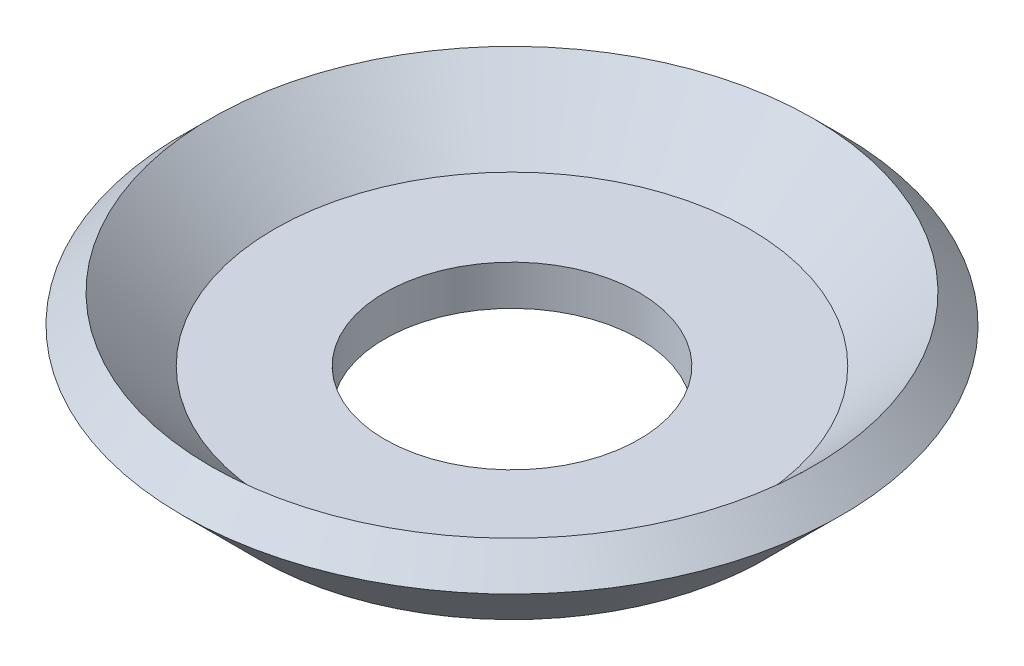
ISO-10303-21;
HEADER;
FILE_DESCRIPTION(('STEP AP214'),'2;1');
FILE_NAME('part.step','',(''),(''),'','','');
FILE_SCHEMA(('AUTOMOTIVE_DESIGN { 1 0 10303 214 1 1 1 1 }'));
ENDSEC;
DATA;
#1=APPLICATION_CONTEXT('core data for automotive mechanical design processes');
#2=APPLICATION_PROTOCOL_DEFINITION('international standard','automotive_design',2000,#1);
#3=PRODUCT_CONTEXT('',#1,'mechanical');
#4=PRODUCT('Part','Part','',(#3));
#5=PRODUCT_RELATED_PRODUCT_CATEGORY('part','',(#4));
#6=PRODUCT_DEFINITION_FORMATION('','',#4);
#7=PRODUCT_DEFINITION_CONTEXT('part definition',#1,'design');
#8=PRODUCT_DEFINITION('design','',#6,#7);
#9=PRODUCT_DEFINITION_SHAPE('','',#8);
#10=(LENGTH_UNIT() NAMED_UNIT(*) SI_UNIT(.MILLI.,.METRE.));
#11=(NAMED_UNIT(*) PLANE_ANGLE_UNIT() SI_UNIT($,.RADIAN.));
#12=(NAMED_UNIT(*) SI_UNIT($,.STERADIAN.) SOLID_ANGLE_UNIT());
#13=UNCERTAINTY_MEASURE_WITH_UNIT(LENGTH_MEASURE(1.E-05),#10,'distance_accuracy_value','');
#14=(GEOMETRIC_REPRESENTATION_CONTEXT(3) GLOBAL_UNCERTAINTY_ASSIGNED_CONTEXT((#13)) GLOBAL_UNIT_ASSIGNED_CONTEXT((#10,
#11,#12)) REPRESENTATION_CONTEXT('',''));
#15=CARTESIAN_POINT('',(0.,0.,0.));
#16=DIRECTION('',(0.,0.,1.));
#17=DIRECTION('',(1.,0.,0.));
#18=AXIS2_PLACEMENT_3D('',#15,#16,#17);
#19=CARTESIAN_POINT('',(0.,0.,0.));
#20=DIRECTION('',(0.,-1.,0.));
#21=DIRECTION('',(0.,0.,-1.));
#22=AXIS2_PLACEMENT_3D('',#19,#20,#21);
#23=CYLINDRICAL_SURFACE('',#22,4.7625);
#24=CARTESIAN_POINT('',(0.,1.5,0.));
#25=DIRECTION('',(0.,-1.,0.));
#26=DIRECTION('',(0.,0.,-1.));
#27=AXIS2_PLACEMENT_3D('',#24,#25,#26);
#28=CIRCLE('',#27,4.7625);
#29=CARTESIAN_POINT('',(0.,1.5,-4.7625));
#30=VERTEX_POINT('',#29);
#31=EDGE_CURVE('E64',#30,#30,#28,.T.);
#32=ORIENTED_EDGE('',*,*,#31,.F.);
#33=EDGE_LOOP('',(#32));
#34=FACE_BOUND('',#33,.T.);
#35=CARTESIAN_POINT('',(0.,0.,0.));
#36=DIRECTION('',(0.,-1.,0.));
#37=DIRECTION('',(0.,0.,-1.));
#38=AXIS2_PLACEMENT_3D('',#35,#36,#37);
#39=CIRCLE('',#38,4.7625);
#40=CARTESIAN_POINT('',(0.,0.,-4.7625));
#41=VERTEX_POINT('',#40);
#42=EDGE_CURVE('E10',#41,#41,#39,.T.);
#43=ORIENTED_EDGE('',*,*,#42,.T.);
#44=EDGE_LOOP('',(#43));
#45=FACE_BOUND('',#44,.T.);
#46=ADVANCED_FACE('F37',(#34,#45),#23,.F.);
#47=CARTESIAN_POINT('',(0.,0.,4.7625));
#48=DIRECTION('',(0.,1.,0.));
#49=DIRECTION('',(0.,0.,1.));
#50=AXIS2_PLACEMENT_3D('',#47,#48,#49);
#51=PLANE('',#50);
#52=ORIENTED_EDGE('',*,*,#42,.F.);
#53=EDGE_LOOP('',(#52));
#54=FACE_BOUND('',#53,.T.);
#55=CARTESIAN_POINT('',(0.,0.,0.));
#56=DIRECTION('',(0.,-1.,0.));
#57=DIRECTION('',(0.,0.,-1.));
#58=AXIS2_PLACEMENT_3D('',#55,#56,#57);
#59=CIRCLE('',#58,9.51132034355964);
#60=CARTESIAN_POINT('',(0.,0.,-9.51132034355964));
#61=VERTEX_POINT('',#60);
#62=EDGE_CURVE('E44',#61,#61,#59,.T.);
#63=ORIENTED_EDGE('',*,*,#62,.T.);
#64=EDGE_LOOP('',(#63));
#65=FACE_BOUND('',#64,.T.);
#66=ADVANCED_FACE('F72',(#54,#65),#51,.F.);
#67=CARTESIAN_POINT('',(0.,2.82842712474619,0.));
#68=DIRECTION('',(0.,1.,0.));
#69=DIRECTION('',(0.,0.,1.));
#70=AXIS2_PLACEMENT_3D('',#67,#68,#69);
#71=CONICAL_SURFACE('',#70,12.3397474683058,0.785398163397447);
#72=ORIENTED_EDGE('',*,*,#62,.F.);
#73=EDGE_LOOP('',(#72));
#74=FACE_BOUND('',#73,.T.);
#75=CARTESIAN_POINT('',(0.,2.82842712474619,0.));
#76=DIRECTION('',(0.,-1.,0.));
#77=DIRECTION('',(0.,0.,-1.));
#78=AXIS2_PLACEMENT_3D('',#75,#76,#77);
#79=CIRCLE('',#78,12.3397474683058);
#80=CARTESIAN_POINT('',(0.,2.82842712474619,-12.3397474683058));
#81=VERTEX_POINT('',#80);
#82=EDGE_CURVE('E49',#81,#81,#79,.T.);
#83=ORIENTED_EDGE('',*,*,#82,.T.);
#84=EDGE_LOOP('',(#83));
#85=FACE_BOUND('',#84,.T.);
#86=ADVANCED_FACE('F76',(#74,#85),#71,.T.);
#87=CARTESIAN_POINT('',(0.,3.88908729652601,0.));
#88=DIRECTION('',(0.,-1.,0.));
#89=DIRECTION('',(0.,0.,-1.));
#90=AXIS2_PLACEMENT_3D('',#87,#88,#89);
#91=CONICAL_SURFACE('',#90,11.279087296526,0.78539816339745);
#92=ORIENTED_EDGE('',*,*,#82,.F.);
#93=EDGE_LOOP('',(#92));
#94=FACE_BOUND('',#93,.T.);
#95=CARTESIAN_POINT('',(0.,3.88908729652601,0.));
#96=DIRECTION('',(0.,-1.,0.));
#97=DIRECTION('',(0.,0.,-1.));
#98=AXIS2_PLACEMENT_3D('',#95,#96,#97);
#99=CIRCLE('',#98,11.279087296526);
#100=CARTESIAN_POINT('',(0.,3.88908729652601,-11.279087296526));
#101=VERTEX_POINT('',#100);
#102=EDGE_CURVE('E54',#101,#101,#99,.T.);
#103=ORIENTED_EDGE('',*,*,#102,.T.);
#104=EDGE_LOOP('',(#103));
#105=FACE_BOUND('',#104,.T.);
#106=ADVANCED_FACE('F81',(#94,#105),#91,.T.);
#107=CARTESIAN_POINT('',(0.,1.5,0.));
#108=DIRECTION('',(0.,1.,0.));
#109=DIRECTION('',(0.,0.,1.));
#110=AXIS2_PLACEMENT_3D('',#107,#108,#109);
#111=CONICAL_SURFACE('',#110,8.89,0.785398163397446);
#112=ORIENTED_EDGE('',*,*,#102,.F.);
#113=EDGE_LOOP('',(#112));
#114=FACE_BOUND('',#113,.T.);
#115=CARTESIAN_POINT('',(0.,1.5,0.));
#116=DIRECTION('',(0.,-1.,0.));
#117=DIRECTION('',(0.,0.,-1.));
#118=AXIS2_PLACEMENT_3D('',#115,#116,#117);
#119=CIRCLE('',#118,8.89);
#120=CARTESIAN_POINT('',(0.,1.5,-8.89));
#121=VERTEX_POINT('',#120);
#122=EDGE_CURVE('E60',#121,#121,#119,.T.);
#123=ORIENTED_EDGE('',*,*,#122,.T.);
#124=EDGE_LOOP('',(#123));
#125=FACE_BOUND('',#124,.T.);
#126=ADVANCED_FACE('F87',(#114,#125),#111,.F.);
#127=CARTESIAN_POINT('',(0.,1.5,8.89));
#128=DIRECTION('',(0.,-1.,0.));
#129=DIRECTION('',(0.,0.,-1.));
#130=AXIS2_PLACEMENT_3D('',#127,#128,#129);
#131=PLANE('',#130);
#132=ORIENTED_EDGE('',*,*,#122,.F.);
#133=EDGE_LOOP('',(#132));
#134=FACE_BOUND('',#133,.T.);
#135=ORIENTED_EDGE('',*,*,#31,.T.);
#136=EDGE_LOOP('',(#135));
#137=FACE_BOUND('',#136,.T.);
#138=ADVANCED_FACE('F69',(#134,#137),#131,.F.);
#139=CLOSED_SHELL('',(#46,#66,#86,#106,#126,#138));
#140=MANIFOLD_SOLID_BREP('B2',#139);
#141=ADVANCED_BREP_SHAPE_REPRESENTATION('',(#18,#140),#14);
#142=SHAPE_DEFINITION_REPRESENTATION(#9,#141);
ENDSEC;
END-ISO-10303-21;
